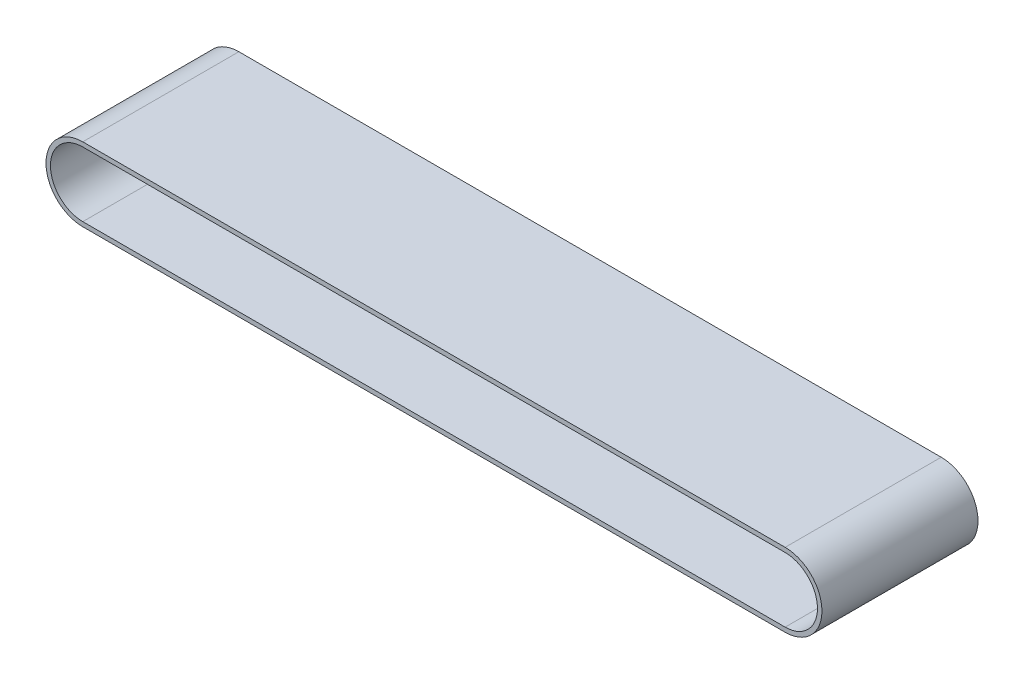
ISO-10303-21;
HEADER;
FILE_DESCRIPTION(('STEP AP214'),'2;1');
FILE_NAME('part.step','',(''),(''),'','','');
FILE_SCHEMA(('AUTOMOTIVE_DESIGN { 1 0 10303 214 1 1 1 1 }'));
ENDSEC;
DATA;
#1=APPLICATION_CONTEXT('core data for automotive mechanical design processes');
#2=APPLICATION_PROTOCOL_DEFINITION('international standard','automotive_design',2000,#1);
#3=PRODUCT_CONTEXT('',#1,'mechanical');
#4=PRODUCT('Part','Part','',(#3));
#5=PRODUCT_RELATED_PRODUCT_CATEGORY('part','',(#4));
#6=PRODUCT_DEFINITION_FORMATION('','',#4);
#7=PRODUCT_DEFINITION_CONTEXT('part definition',#1,'design');
#8=PRODUCT_DEFINITION('design','',#6,#7);
#9=PRODUCT_DEFINITION_SHAPE('','',#8);
#10=(LENGTH_UNIT() NAMED_UNIT(*) SI_UNIT(.MILLI.,.METRE.));
#11=(NAMED_UNIT(*) PLANE_ANGLE_UNIT() SI_UNIT($,.RADIAN.));
#12=(NAMED_UNIT(*) SI_UNIT($,.STERADIAN.) SOLID_ANGLE_UNIT());
#13=UNCERTAINTY_MEASURE_WITH_UNIT(LENGTH_MEASURE(1.E-05),#10,'distance_accuracy_value','');
#14=(GEOMETRIC_REPRESENTATION_CONTEXT(3) GLOBAL_UNCERTAINTY_ASSIGNED_CONTEXT((#13)) GLOBAL_UNIT_ASSIGNED_CONTEXT((#10,
#11,#12)) REPRESENTATION_CONTEXT('',''));
#15=CARTESIAN_POINT('',(0.,0.,0.));
#16=DIRECTION('',(0.,0.,1.));
#17=DIRECTION('',(1.,0.,0.));
#18=AXIS2_PLACEMENT_3D('',#15,#16,#17);
#19=CARTESIAN_POINT('',(0.,-16.5,35.));
#20=DIRECTION('',(0.,-1.,0.));
#21=DIRECTION('',(0.,0.,-1.));
#22=AXIS2_PLACEMENT_3D('',#19,#20,#21);
#23=PLANE('',#22);
#24=DIRECTION('',(-1.,0.,0.));
#25=VECTOR('',#24,1.);
#26=CARTESIAN_POINT('',(0.,-16.5,-35.));
#27=LINE('',#26,#25);
#28=CARTESIAN_POINT('',(315.000000000023,-16.5,-35.));
#29=VERTEX_POINT('',#28);
#30=CARTESIAN_POINT('',(-3.83026943495679E-12,-16.5,-35.));
#31=VERTEX_POINT('',#30);
#32=EDGE_CURVE('E165',#29,#31,#27,.T.);
#33=ORIENTED_EDGE('',*,*,#32,.F.);
#34=DIRECTION('',(0.,0.,-1.));
#35=VECTOR('',#34,1.);
#36=CARTESIAN_POINT('',(315.000000000023,-16.5,35.));
#37=LINE('',#36,#35);
#38=CARTESIAN_POINT('',(315.000000000023,-16.5,35.));
#39=VERTEX_POINT('',#38);
#40=EDGE_CURVE('E12',#39,#29,#37,.T.);
#41=ORIENTED_EDGE('',*,*,#40,.F.);
#42=DIRECTION('',(-1.,0.,0.));
#43=VECTOR('',#42,1.);
#44=CARTESIAN_POINT('',(0.,-16.5,35.));
#45=LINE('',#44,#43);
#46=CARTESIAN_POINT('',(-3.83026943495679E-12,-16.5,35.));
#47=VERTEX_POINT('',#46);
#48=EDGE_CURVE('E169',#39,#47,#45,.T.);
#49=ORIENTED_EDGE('',*,*,#48,.T.);
#50=DIRECTION('',(0.,0.,-1.));
#51=VECTOR('',#50,1.);
#52=CARTESIAN_POINT('',(-3.83026943495679E-12,-16.5,35.));
#53=LINE('',#52,#51);
#54=EDGE_CURVE('E70',#47,#31,#53,.T.);
#55=ORIENTED_EDGE('',*,*,#54,.T.);
#56=EDGE_LOOP('',(#33,#41,#49,#55));
#57=FACE_BOUND('',#56,.T.);
#58=ADVANCED_FACE('F67',(#57),#23,.T.);
#59=CARTESIAN_POINT('',(315.000000000028,0.,35.));
#60=DIRECTION('',(0.,0.,-1.));
#61=DIRECTION('',(-1.,0.,0.));
#62=AXIS2_PLACEMENT_3D('',#59,#60,#61);
#63=CYLINDRICAL_SURFACE('',#62,16.5);
#64=CARTESIAN_POINT('',(315.000000000028,0.,-35.));
#65=DIRECTION('',(0.,0.,-1.));
#66=DIRECTION('',(-1.,0.,0.));
#67=AXIS2_PLACEMENT_3D('',#64,#65,#66);
#68=CIRCLE('',#67,16.5);
#69=CARTESIAN_POINT('',(315.000000000032,16.5,-35.));
#70=VERTEX_POINT('',#69);
#71=EDGE_CURVE('E173',#70,#29,#68,.T.);
#72=ORIENTED_EDGE('',*,*,#71,.F.);
#73=DIRECTION('',(0.,0.,-1.));
#74=VECTOR('',#73,1.);
#75=CARTESIAN_POINT('',(315.000000000032,16.5,35.));
#76=LINE('',#75,#74);
#77=CARTESIAN_POINT('',(315.000000000032,16.5,35.));
#78=VERTEX_POINT('',#77);
#79=EDGE_CURVE('E75',#78,#70,#76,.T.);
#80=ORIENTED_EDGE('',*,*,#79,.F.);
#81=CARTESIAN_POINT('',(315.000000000028,0.,35.));
#82=DIRECTION('',(0.,0.,-1.));
#83=DIRECTION('',(-1.,0.,0.));
#84=AXIS2_PLACEMENT_3D('',#81,#82,#83);
#85=CIRCLE('',#84,16.5);
#86=EDGE_CURVE('E179',#78,#39,#85,.T.);
#87=ORIENTED_EDGE('',*,*,#86,.T.);
#88=ORIENTED_EDGE('',*,*,#40,.T.);
#89=EDGE_LOOP('',(#72,#80,#87,#88));
#90=FACE_BOUND('',#89,.T.);
#91=ADVANCED_FACE('F205',(#90),#63,.T.);
#92=CARTESIAN_POINT('',(0.,16.5,35.));
#93=DIRECTION('',(0.,1.,0.));
#94=DIRECTION('',(0.,0.,1.));
#95=AXIS2_PLACEMENT_3D('',#92,#93,#94);
#96=PLANE('',#95);
#97=DIRECTION('',(1.,0.,0.));
#98=VECTOR('',#97,1.);
#99=CARTESIAN_POINT('',(0.,16.5,-35.));
#100=LINE('',#99,#98);
#101=CARTESIAN_POINT('',(4.36616295605622E-12,16.5,-35.));
#102=VERTEX_POINT('',#101);
#103=EDGE_CURVE('E187',#102,#70,#100,.T.);
#104=ORIENTED_EDGE('',*,*,#103,.F.);
#105=DIRECTION('',(0.,0.,-1.));
#106=VECTOR('',#105,1.);
#107=CARTESIAN_POINT('',(4.36616295605622E-12,16.5,35.));
#108=LINE('',#107,#106);
#109=CARTESIAN_POINT('',(4.36616295605622E-12,16.5,35.));
#110=VERTEX_POINT('',#109);
#111=EDGE_CURVE('E192',#110,#102,#108,.T.);
#112=ORIENTED_EDGE('',*,*,#111,.F.);
#113=DIRECTION('',(1.,0.,0.));
#114=VECTOR('',#113,1.);
#115=CARTESIAN_POINT('',(0.,16.5,35.));
#116=LINE('',#115,#114);
#117=EDGE_CURVE('E176',#110,#78,#116,.T.);
#118=ORIENTED_EDGE('',*,*,#117,.T.);
#119=ORIENTED_EDGE('',*,*,#79,.T.);
#120=EDGE_LOOP('',(#104,#112,#118,#119));
#121=FACE_BOUND('',#120,.T.);
#122=ADVANCED_FACE('F209',(#121),#96,.T.);
#123=CARTESIAN_POINT('',(0.,0.,35.));
#124=DIRECTION('',(0.,0.,-1.));
#125=DIRECTION('',(-1.,0.,0.));
#126=AXIS2_PLACEMENT_3D('',#123,#124,#125);
#127=CYLINDRICAL_SURFACE('',#126,16.5);
#128=CARTESIAN_POINT('',(0.,0.,-35.));
#129=DIRECTION('',(0.,0.,-1.));
#130=DIRECTION('',(-1.,0.,0.));
#131=AXIS2_PLACEMENT_3D('',#128,#129,#130);
#132=CIRCLE('',#131,16.5);
#133=EDGE_CURVE('E184',#31,#102,#132,.T.);
#134=ORIENTED_EDGE('',*,*,#133,.F.);
#135=ORIENTED_EDGE('',*,*,#54,.F.);
#136=CARTESIAN_POINT('',(0.,0.,35.));
#137=DIRECTION('',(0.,0.,-1.));
#138=DIRECTION('',(-1.,0.,0.));
#139=AXIS2_PLACEMENT_3D('',#136,#137,#138);
#140=CIRCLE('',#139,16.5);
#141=EDGE_CURVE('E172',#47,#110,#140,.T.);
#142=ORIENTED_EDGE('',*,*,#141,.T.);
#143=ORIENTED_EDGE('',*,*,#111,.T.);
#144=EDGE_LOOP('',(#134,#135,#142,#143));
#145=FACE_BOUND('',#144,.T.);
#146=ADVANCED_FACE('F200',(#145),#127,.T.);
#147=CARTESIAN_POINT('',(0.,0.,35.));
#148=DIRECTION('',(0.,0.,-1.));
#149=DIRECTION('',(-1.,0.,0.));
#150=AXIS2_PLACEMENT_3D('',#147,#148,#149);
#151=PLANE('',#150);
#152=CARTESIAN_POINT('',(315.000000000028,0.,35.));
#153=DIRECTION('',(0.,0.,-1.));
#154=DIRECTION('',(-1.,0.,0.));
#155=AXIS2_PLACEMENT_3D('',#152,#153,#154);
#156=CIRCLE('',#155,14.5);
#157=CARTESIAN_POINT('',(315.000000000032,14.5,35.));
#158=VERTEX_POINT('',#157);
#159=CARTESIAN_POINT('',(315.000000000024,-14.5,35.));
#160=VERTEX_POINT('',#159);
#161=EDGE_CURVE('E140',#158,#160,#156,.T.);
#162=ORIENTED_EDGE('',*,*,#161,.T.);
#163=DIRECTION('',(-1.,0.,0.));
#164=VECTOR('',#163,1.);
#165=CARTESIAN_POINT('',(315.000000000024,-14.5,35.));
#166=LINE('',#165,#164);
#167=CARTESIAN_POINT('',(-3.8351553447361E-12,-14.5,35.));
#168=VERTEX_POINT('',#167);
#169=EDGE_CURVE('E134',#160,#168,#166,.T.);
#170=ORIENTED_EDGE('',*,*,#169,.T.);
#171=CARTESIAN_POINT('',(0.,0.,35.));
#172=DIRECTION('',(0.,0.,-1.));
#173=DIRECTION('',(-1.,0.,0.));
#174=AXIS2_PLACEMENT_3D('',#171,#172,#173);
#175=CIRCLE('',#174,14.5);
#176=CARTESIAN_POINT('',(3.83693108259486E-12,14.5,35.));
#177=VERTEX_POINT('',#176);
#178=EDGE_CURVE('E143',#168,#177,#175,.T.);
#179=ORIENTED_EDGE('',*,*,#178,.T.);
#180=DIRECTION('',(1.,0.,0.));
#181=VECTOR('',#180,1.);
#182=CARTESIAN_POINT('',(3.84369289042532E-12,14.5,35.));
#183=LINE('',#182,#181);
#184=EDGE_CURVE('E83',#177,#158,#183,.T.);
#185=ORIENTED_EDGE('',*,*,#184,.T.);
#186=EDGE_LOOP('',(#162,#170,#179,#185));
#187=FACE_BOUND('',#186,.T.);
#188=ORIENTED_EDGE('',*,*,#48,.F.);
#189=ORIENTED_EDGE('',*,*,#86,.F.);
#190=ORIENTED_EDGE('',*,*,#117,.F.);
#191=ORIENTED_EDGE('',*,*,#141,.F.);
#192=EDGE_LOOP('',(#188,#189,#190,#191));
#193=FACE_BOUND('',#192,.T.);
#194=ADVANCED_FACE('F147',(#187,#193),#151,.F.);
#195=CARTESIAN_POINT('',(0.,0.,-35.));
#196=DIRECTION('',(0.,0.,-1.));
#197=DIRECTION('',(-1.,0.,0.));
#198=AXIS2_PLACEMENT_3D('',#195,#196,#197);
#199=PLANE('',#198);
#200=DIRECTION('',(-1.,0.,0.));
#201=VECTOR('',#200,1.);
#202=CARTESIAN_POINT('',(315.000000000024,-14.5,-35.));
#203=LINE('',#202,#201);
#204=CARTESIAN_POINT('',(315.000000000024,-14.5,-35.));
#205=VERTEX_POINT('',#204);
#206=CARTESIAN_POINT('',(-3.8351553447361E-12,-14.5,-35.));
#207=VERTEX_POINT('',#206);
#208=EDGE_CURVE('E91',#205,#207,#203,.T.);
#209=ORIENTED_EDGE('',*,*,#208,.F.);
#210=CARTESIAN_POINT('',(315.000000000028,0.,-35.));
#211=DIRECTION('',(0.,0.,-1.));
#212=DIRECTION('',(-1.,0.,0.));
#213=AXIS2_PLACEMENT_3D('',#210,#211,#212);
#214=CIRCLE('',#213,14.5);
#215=CARTESIAN_POINT('',(315.000000000032,14.5,-35.));
#216=VERTEX_POINT('',#215);
#217=EDGE_CURVE('E150',#216,#205,#214,.T.);
#218=ORIENTED_EDGE('',*,*,#217,.F.);
#219=DIRECTION('',(1.,0.,0.));
#220=VECTOR('',#219,1.);
#221=CARTESIAN_POINT('',(3.84369289042532E-12,14.5,-35.));
#222=LINE('',#221,#220);
#223=CARTESIAN_POINT('',(3.83693108259486E-12,14.5,-35.));
#224=VERTEX_POINT('',#223);
#225=EDGE_CURVE('E153',#224,#216,#222,.T.);
#226=ORIENTED_EDGE('',*,*,#225,.F.);
#227=CARTESIAN_POINT('',(0.,0.,-35.));
#228=DIRECTION('',(0.,0.,-1.));
#229=DIRECTION('',(-1.,0.,0.));
#230=AXIS2_PLACEMENT_3D('',#227,#228,#229);
#231=CIRCLE('',#230,14.5);
#232=EDGE_CURVE('E159',#207,#224,#231,.T.);
#233=ORIENTED_EDGE('',*,*,#232,.F.);
#234=EDGE_LOOP('',(#209,#218,#226,#233));
#235=FACE_BOUND('',#234,.T.);
#236=ORIENTED_EDGE('',*,*,#32,.T.);
#237=ORIENTED_EDGE('',*,*,#133,.T.);
#238=ORIENTED_EDGE('',*,*,#103,.T.);
#239=ORIENTED_EDGE('',*,*,#71,.T.);
#240=EDGE_LOOP('',(#236,#237,#238,#239));
#241=FACE_BOUND('',#240,.T.);
#242=ADVANCED_FACE('F202',(#235,#241),#199,.T.);
#243=CARTESIAN_POINT('',(315.000000000024,-14.5,35.));
#244=DIRECTION('',(0.,-1.,0.));
#245=DIRECTION('',(0.,0.,-1.));
#246=AXIS2_PLACEMENT_3D('',#243,#244,#245);
#247=PLANE('',#246);
#248=ORIENTED_EDGE('',*,*,#208,.T.);
#249=DIRECTION('',(0.,0.,-1.));
#250=VECTOR('',#249,1.);
#251=CARTESIAN_POINT('',(-3.8351553447361E-12,-14.5,35.));
#252=LINE('',#251,#250);
#253=EDGE_CURVE('E130',#168,#207,#252,.T.);
#254=ORIENTED_EDGE('',*,*,#253,.F.);
#255=ORIENTED_EDGE('',*,*,#169,.F.);
#256=DIRECTION('',(0.,0.,-1.));
#257=VECTOR('',#256,1.);
#258=CARTESIAN_POINT('',(315.000000000024,-14.5,35.));
#259=LINE('',#258,#257);
#260=EDGE_CURVE('E163',#160,#205,#259,.T.);
#261=ORIENTED_EDGE('',*,*,#260,.T.);
#262=EDGE_LOOP('',(#248,#254,#255,#261));
#263=FACE_BOUND('',#262,.T.);
#264=ADVANCED_FACE('F132',(#263),#247,.F.);
#265=CARTESIAN_POINT('',(315.000000000028,0.,35.));
#266=DIRECTION('',(0.,0.,-1.));
#267=DIRECTION('',(-1.,0.,0.));
#268=AXIS2_PLACEMENT_3D('',#265,#266,#267);
#269=CYLINDRICAL_SURFACE('',#268,14.5);
#270=ORIENTED_EDGE('',*,*,#217,.T.);
#271=ORIENTED_EDGE('',*,*,#260,.F.);
#272=ORIENTED_EDGE('',*,*,#161,.F.);
#273=DIRECTION('',(0.,0.,-1.));
#274=VECTOR('',#273,1.);
#275=CARTESIAN_POINT('',(315.000000000032,14.5,35.));
#276=LINE('',#275,#274);
#277=EDGE_CURVE('E166',#158,#216,#276,.T.);
#278=ORIENTED_EDGE('',*,*,#277,.T.);
#279=EDGE_LOOP('',(#270,#271,#272,#278));
#280=FACE_BOUND('',#279,.T.);
#281=ADVANCED_FACE('F260',(#280),#269,.F.);
#282=CARTESIAN_POINT('',(3.84369289042532E-12,14.5,35.));
#283=DIRECTION('',(0.,1.,0.));
#284=DIRECTION('',(0.,0.,1.));
#285=AXIS2_PLACEMENT_3D('',#282,#283,#284);
#286=PLANE('',#285);
#287=ORIENTED_EDGE('',*,*,#225,.T.);
#288=ORIENTED_EDGE('',*,*,#277,.F.);
#289=ORIENTED_EDGE('',*,*,#184,.F.);
#290=DIRECTION('',(0.,0.,-1.));
#291=VECTOR('',#290,1.);
#292=CARTESIAN_POINT('',(3.83693108259486E-12,14.5,35.));
#293=LINE('',#292,#291);
#294=EDGE_CURVE('E139',#177,#224,#293,.T.);
#295=ORIENTED_EDGE('',*,*,#294,.T.);
#296=EDGE_LOOP('',(#287,#288,#289,#295));
#297=FACE_BOUND('',#296,.T.);
#298=ADVANCED_FACE('F269',(#297),#286,.F.);
#299=CARTESIAN_POINT('',(0.,0.,35.));
#300=DIRECTION('',(0.,0.,-1.));
#301=DIRECTION('',(-1.,0.,0.));
#302=AXIS2_PLACEMENT_3D('',#299,#300,#301);
#303=CYLINDRICAL_SURFACE('',#302,14.5);
#304=ORIENTED_EDGE('',*,*,#232,.T.);
#305=ORIENTED_EDGE('',*,*,#294,.F.);
#306=ORIENTED_EDGE('',*,*,#178,.F.);
#307=ORIENTED_EDGE('',*,*,#253,.T.);
#308=EDGE_LOOP('',(#304,#305,#306,#307));
#309=FACE_BOUND('',#308,.T.);
#310=ADVANCED_FACE('F144',(#309),#303,.F.);
#311=CLOSED_SHELL('',(#58,#91,#122,#146,#194,#242,#264,#281,#298,#310));
#312=MANIFOLD_SOLID_BREP('B2',#311);
#313=ADVANCED_BREP_SHAPE_REPRESENTATION('',(#18,#312),#14);
#314=SHAPE_DEFINITION_REPRESENTATION(#9,#313);
ENDSEC;
END-ISO-10303-21;
